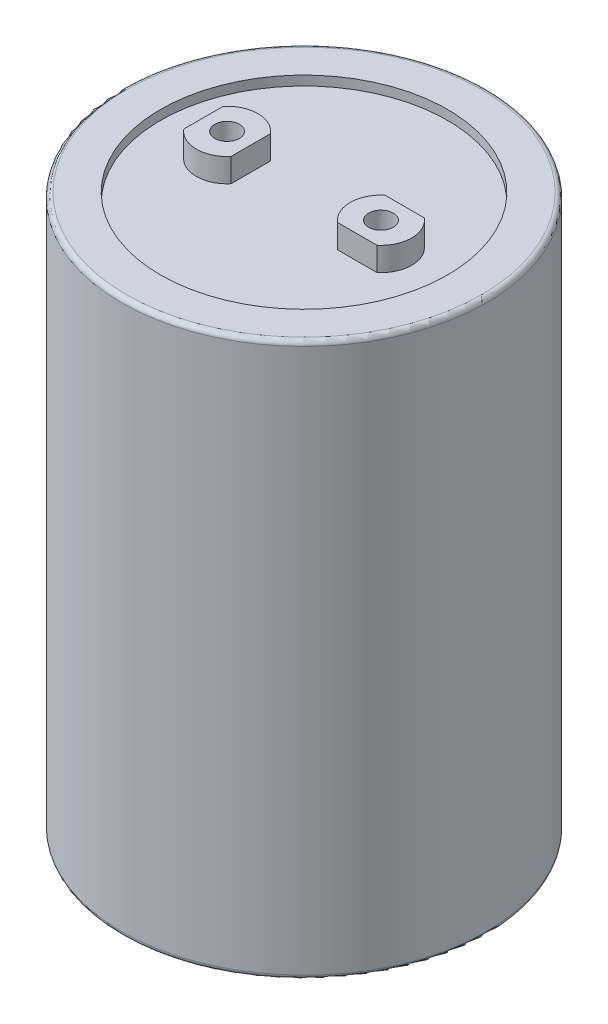
ISO-10303-21;
HEADER;
FILE_DESCRIPTION(('STEP AP214'),'2;1');
FILE_NAME('part.step','',(''),(''),'','','');
FILE_SCHEMA(('AUTOMOTIVE_DESIGN { 1 0 10303 214 1 1 1 1 }'));
ENDSEC;
DATA;
#1=APPLICATION_CONTEXT('core data for automotive mechanical design processes');
#2=APPLICATION_PROTOCOL_DEFINITION('international standard','automotive_design',2000,#1);
#3=PRODUCT_CONTEXT('',#1,'mechanical');
#4=PRODUCT('Part','Part','',(#3));
#5=PRODUCT_RELATED_PRODUCT_CATEGORY('part','',(#4));
#6=PRODUCT_DEFINITION_FORMATION('','',#4);
#7=PRODUCT_DEFINITION_CONTEXT('part definition',#1,'design');
#8=PRODUCT_DEFINITION('design','',#6,#7);
#9=PRODUCT_DEFINITION_SHAPE('','',#8);
#10=(LENGTH_UNIT() NAMED_UNIT(*) SI_UNIT(.MILLI.,.METRE.));
#11=(NAMED_UNIT(*) PLANE_ANGLE_UNIT() SI_UNIT($,.RADIAN.));
#12=(NAMED_UNIT(*) SI_UNIT($,.STERADIAN.) SOLID_ANGLE_UNIT());
#13=UNCERTAINTY_MEASURE_WITH_UNIT(LENGTH_MEASURE(1.E-05),#10,'distance_accuracy_value','');
#14=(GEOMETRIC_REPRESENTATION_CONTEXT(3) GLOBAL_UNCERTAINTY_ASSIGNED_CONTEXT((#13)) GLOBAL_UNIT_ASSIGNED_CONTEXT((#10,
#11,#12)) REPRESENTATION_CONTEXT('',''));
#15=CARTESIAN_POINT('',(0.,0.,0.));
#16=DIRECTION('',(0.,0.,1.));
#17=DIRECTION('',(1.,0.,0.));
#18=AXIS2_PLACEMENT_3D('',#15,#16,#17);
#19=CARTESIAN_POINT('',(0.,115.,0.));
#20=DIRECTION('',(0.,1.,0.));
#21=DIRECTION('',(0.,0.,1.));
#22=AXIS2_PLACEMENT_3D('',#19,#20,#21);
#23=PLANE('',#22);
#24=DIRECTION('',(0.,0.,1.));
#25=VECTOR('',#24,1.);
#26=CARTESIAN_POINT('',(-21.25,115.,-4.15331193145904));
#27=LINE('',#26,#25);
#28=CARTESIAN_POINT('',(-21.25,115.,-4.15331193145904));
#29=VERTEX_POINT('',#28);
#30=CARTESIAN_POINT('',(-21.25,115.,4.15331193145903));
#31=VERTEX_POINT('',#30);
#32=EDGE_CURVE('E148',#29,#31,#27,.T.);
#33=ORIENTED_EDGE('',*,*,#32,.F.);
#34=CARTESIAN_POINT('',(-16.25,115.,0.));
#35=DIRECTION('',(0.,1.,0.));
#36=DIRECTION('',(0.,0.,1.));
#37=AXIS2_PLACEMENT_3D('',#34,#35,#36);
#38=CIRCLE('',#37,6.5);
#39=CARTESIAN_POINT('',(-11.25,115.,-4.15331193145904));
#40=VERTEX_POINT('',#39);
#41=EDGE_CURVE('E130',#40,#29,#38,.T.);
#42=ORIENTED_EDGE('',*,*,#41,.F.);
#43=DIRECTION('',(0.,0.,-1.));
#44=VECTOR('',#43,1.);
#45=CARTESIAN_POINT('',(-11.25,115.,4.15331193145904));
#46=LINE('',#45,#44);
#47=CARTESIAN_POINT('',(-11.25,115.,4.15331193145904));
#48=VERTEX_POINT('',#47);
#49=EDGE_CURVE('E139',#48,#40,#46,.T.);
#50=ORIENTED_EDGE('',*,*,#49,.F.);
#51=CARTESIAN_POINT('',(-16.25,115.,0.));
#52=DIRECTION('',(0.,1.,0.));
#53=DIRECTION('',(0.,0.,-1.));
#54=AXIS2_PLACEMENT_3D('',#51,#52,#53);
#55=CIRCLE('',#54,6.5);
#56=EDGE_CURVE('E150',#31,#48,#55,.T.);
#57=ORIENTED_EDGE('',*,*,#56,.F.);
#58=EDGE_LOOP('',(#33,#42,#50,#57));
#59=FACE_BOUND('',#58,.T.);
#60=DIRECTION('',(-1.,0.,0.));
#61=VECTOR('',#60,1.);
#62=CARTESIAN_POINT('',(12.096688068541,115.,-5.));
#63=LINE('',#62,#61);
#64=CARTESIAN_POINT('',(20.403311931459,115.,-5.));
#65=VERTEX_POINT('',#64);
#66=CARTESIAN_POINT('',(12.096688068541,115.,-5.));
#67=VERTEX_POINT('',#66);
#68=EDGE_CURVE('E420',#65,#67,#63,.T.);
#69=ORIENTED_EDGE('',*,*,#68,.F.);
#70=CARTESIAN_POINT('',(16.25,115.,0.));
#71=DIRECTION('',(0.,1.,0.));
#72=DIRECTION('',(0.,0.,-1.));
#73=AXIS2_PLACEMENT_3D('',#70,#71,#72);
#74=CIRCLE('',#73,6.5);
#75=CARTESIAN_POINT('',(20.403311931459,115.,5.));
#76=VERTEX_POINT('',#75);
#77=EDGE_CURVE('E125',#76,#65,#74,.T.);
#78=ORIENTED_EDGE('',*,*,#77,.F.);
#79=DIRECTION('',(1.,0.,0.));
#80=VECTOR('',#79,1.);
#81=CARTESIAN_POINT('',(20.403311931459,115.,5.));
#82=LINE('',#81,#80);
#83=CARTESIAN_POINT('',(12.096688068541,115.,5.));
#84=VERTEX_POINT('',#83);
#85=EDGE_CURVE('E121',#84,#76,#82,.T.);
#86=ORIENTED_EDGE('',*,*,#85,.F.);
#87=CARTESIAN_POINT('',(16.25,115.,0.));
#88=DIRECTION('',(0.,1.,0.));
#89=DIRECTION('',(0.,0.,1.));
#90=AXIS2_PLACEMENT_3D('',#87,#88,#89);
#91=CIRCLE('',#90,6.50000000000001);
#92=EDGE_CURVE('E422',#67,#84,#91,.T.);
#93=ORIENTED_EDGE('',*,*,#92,.F.);
#94=EDGE_LOOP('',(#69,#78,#86,#93));
#95=FACE_BOUND('',#94,.T.);
#96=CARTESIAN_POINT('',(0.,115.,0.));
#97=DIRECTION('',(0.,1.,0.));
#98=DIRECTION('',(0.,0.,1.));
#99=AXIS2_PLACEMENT_3D('',#96,#97,#98);
#100=CIRCLE('',#99,30.3);
#101=CARTESIAN_POINT('',(0.,115.,30.3));
#102=VERTEX_POINT('',#101);
#103=EDGE_CURVE('E167',#102,#102,#100,.F.);
#104=ORIENTED_EDGE('',*,*,#103,.F.);
#105=EDGE_LOOP('',(#104));
#106=FACE_BOUND('',#105,.T.);
#107=ADVANCED_FACE('F35',(#59,#95,#106),#23,.T.);
#108=CARTESIAN_POINT('',(-16.25,120.,0.));
#109=DIRECTION('',(0.,1.,0.));
#110=DIRECTION('',(0.,0.,1.));
#111=AXIS2_PLACEMENT_3D('',#108,#109,#110);
#112=PLANE('',#111);
#113=CARTESIAN_POINT('',(-16.25,120.,0.));
#114=DIRECTION('',(0.,1.,0.));
#115=DIRECTION('',(0.,0.,1.));
#116=AXIS2_PLACEMENT_3D('',#113,#114,#115);
#117=CIRCLE('',#116,6.5);
#118=CARTESIAN_POINT('',(-11.25,120.,-4.15331193145904));
#119=VERTEX_POINT('',#118);
#120=CARTESIAN_POINT('',(-21.25,120.,-4.15331193145904));
#121=VERTEX_POINT('',#120);
#122=EDGE_CURVE('E135',#119,#121,#117,.T.);
#123=ORIENTED_EDGE('',*,*,#122,.T.);
#124=DIRECTION('',(0.,0.,1.));
#125=VECTOR('',#124,1.);
#126=CARTESIAN_POINT('',(-21.25,120.,-4.15331193145904));
#127=LINE('',#126,#125);
#128=CARTESIAN_POINT('',(-21.25,120.,4.15331193145903));
#129=VERTEX_POINT('',#128);
#130=EDGE_CURVE('E138',#121,#129,#127,.T.);
#131=ORIENTED_EDGE('',*,*,#130,.T.);
#132=CARTESIAN_POINT('',(-16.25,120.,0.));
#133=DIRECTION('',(0.,1.,0.));
#134=DIRECTION('',(0.,0.,-1.));
#135=AXIS2_PLACEMENT_3D('',#132,#133,#134);
#136=CIRCLE('',#135,6.5);
#137=CARTESIAN_POINT('',(-11.25,120.,4.15331193145904));
#138=VERTEX_POINT('',#137);
#139=EDGE_CURVE('E141',#129,#138,#136,.T.);
#140=ORIENTED_EDGE('',*,*,#139,.T.);
#141=DIRECTION('',(0.,0.,-1.));
#142=VECTOR('',#141,1.);
#143=CARTESIAN_POINT('',(-11.25,120.,4.15331193145904));
#144=LINE('',#143,#142);
#145=EDGE_CURVE('E143',#138,#119,#144,.T.);
#146=ORIENTED_EDGE('',*,*,#145,.T.);
#147=EDGE_LOOP('',(#123,#131,#140,#146));
#148=FACE_BOUND('',#147,.T.);
#149=CARTESIAN_POINT('',(-16.25,120.,0.));
#150=DIRECTION('',(0.,1.,0.));
#151=DIRECTION('',(0.,0.,1.));
#152=AXIS2_PLACEMENT_3D('',#149,#150,#151);
#153=CIRCLE('',#152,2.6);
#154=CARTESIAN_POINT('',(-16.25,120.,2.6));
#155=VERTEX_POINT('',#154);
#156=EDGE_CURVE('E127',#155,#155,#153,.T.);
#157=ORIENTED_EDGE('',*,*,#156,.F.);
#158=EDGE_LOOP('',(#157));
#159=FACE_BOUND('',#158,.T.);
#160=ADVANCED_FACE('F199',(#148,#159),#112,.T.);
#161=CARTESIAN_POINT('',(-16.25,120.,0.));
#162=DIRECTION('',(0.,-1.,0.));
#163=DIRECTION('',(0.,0.,-1.));
#164=AXIS2_PLACEMENT_3D('',#161,#162,#163);
#165=CYLINDRICAL_SURFACE('',#164,6.5);
#166=ORIENTED_EDGE('',*,*,#41,.T.);
#167=DIRECTION('',(0.,-1.,0.));
#168=VECTOR('',#167,1.);
#169=CARTESIAN_POINT('',(-21.25,120.,-4.15331193145904));
#170=LINE('',#169,#168);
#171=EDGE_CURVE('E159',#121,#29,#170,.T.);
#172=ORIENTED_EDGE('',*,*,#171,.F.);
#173=ORIENTED_EDGE('',*,*,#122,.F.);
#174=DIRECTION('',(0.,-1.,0.));
#175=VECTOR('',#174,1.);
#176=CARTESIAN_POINT('',(-11.25,120.,-4.15331193145904));
#177=LINE('',#176,#175);
#178=EDGE_CURVE('E145',#119,#40,#177,.T.);
#179=ORIENTED_EDGE('',*,*,#178,.T.);
#180=EDGE_LOOP('',(#166,#172,#173,#179));
#181=FACE_BOUND('',#180,.T.);
#182=ADVANCED_FACE('F207',(#181),#165,.T.);
#183=CARTESIAN_POINT('',(-21.25,120.,-4.15331193145904));
#184=DIRECTION('',(1.,0.,0.));
#185=DIRECTION('',(0.,0.,-1.));
#186=AXIS2_PLACEMENT_3D('',#183,#184,#185);
#187=PLANE('',#186);
#188=ORIENTED_EDGE('',*,*,#32,.T.);
#189=DIRECTION('',(0.,-1.,0.));
#190=VECTOR('',#189,1.);
#191=CARTESIAN_POINT('',(-21.25,120.,4.15331193145903));
#192=LINE('',#191,#190);
#193=EDGE_CURVE('E156',#129,#31,#192,.T.);
#194=ORIENTED_EDGE('',*,*,#193,.F.);
#195=ORIENTED_EDGE('',*,*,#130,.F.);
#196=ORIENTED_EDGE('',*,*,#171,.T.);
#197=EDGE_LOOP('',(#188,#194,#195,#196));
#198=FACE_BOUND('',#197,.T.);
#199=ADVANCED_FACE('F240',(#198),#187,.F.);
#200=CARTESIAN_POINT('',(-16.25,120.,0.));
#201=DIRECTION('',(0.,-1.,0.));
#202=DIRECTION('',(0.,0.,-1.));
#203=AXIS2_PLACEMENT_3D('',#200,#201,#202);
#204=CYLINDRICAL_SURFACE('',#203,6.5);
#205=ORIENTED_EDGE('',*,*,#56,.T.);
#206=DIRECTION('',(0.,-1.,0.));
#207=VECTOR('',#206,1.);
#208=CARTESIAN_POINT('',(-11.25,120.,4.15331193145904));
#209=LINE('',#208,#207);
#210=EDGE_CURVE('E58',#138,#48,#209,.T.);
#211=ORIENTED_EDGE('',*,*,#210,.F.);
#212=ORIENTED_EDGE('',*,*,#139,.F.);
#213=ORIENTED_EDGE('',*,*,#193,.T.);
#214=EDGE_LOOP('',(#205,#211,#212,#213));
#215=FACE_BOUND('',#214,.T.);
#216=ADVANCED_FACE('F233',(#215),#204,.T.);
#217=CARTESIAN_POINT('',(-11.25,120.,4.15331193145904));
#218=DIRECTION('',(-1.,0.,0.));
#219=DIRECTION('',(0.,0.,1.));
#220=AXIS2_PLACEMENT_3D('',#217,#218,#219);
#221=PLANE('',#220);
#222=ORIENTED_EDGE('',*,*,#49,.T.);
#223=ORIENTED_EDGE('',*,*,#178,.F.);
#224=ORIENTED_EDGE('',*,*,#145,.F.);
#225=ORIENTED_EDGE('',*,*,#210,.T.);
#226=EDGE_LOOP('',(#222,#223,#224,#225));
#227=FACE_BOUND('',#226,.T.);
#228=ADVANCED_FACE('F225',(#227),#221,.F.);
#229=CARTESIAN_POINT('',(-16.25,120.,0.));
#230=DIRECTION('',(0.,-1.,0.));
#231=DIRECTION('',(0.,0.,-1.));
#232=AXIS2_PLACEMENT_3D('',#229,#230,#231);
#233=CYLINDRICAL_SURFACE('',#232,2.6);
#234=ORIENTED_EDGE('',*,*,#156,.T.);
#235=EDGE_LOOP('',(#234));
#236=FACE_BOUND('',#235,.T.);
#237=CARTESIAN_POINT('',(-16.25,115.,0.));
#238=DIRECTION('',(0.,1.,0.));
#239=DIRECTION('',(0.,0.,1.));
#240=AXIS2_PLACEMENT_3D('',#237,#238,#239);
#241=CIRCLE('',#240,2.6);
#242=CARTESIAN_POINT('',(-16.25,115.,2.6));
#243=VERTEX_POINT('',#242);
#244=EDGE_CURVE('E161',#243,#243,#241,.F.);
#245=ORIENTED_EDGE('',*,*,#244,.T.);
#246=EDGE_LOOP('',(#245));
#247=FACE_BOUND('',#246,.T.);
#248=ADVANCED_FACE('F218',(#236,#247),#233,.F.);
#249=ORIENTED_EDGE('',*,*,#244,.F.);
#250=EDGE_LOOP('',(#249));
#251=FACE_BOUND('',#250,.T.);
#252=ADVANCED_FACE('F203',(#251),#23,.T.);
#253=CARTESIAN_POINT('',(16.25,120.,0.));
#254=DIRECTION('',(0.,-1.,0.));
#255=DIRECTION('',(0.,0.,-1.));
#256=AXIS2_PLACEMENT_3D('',#253,#254,#255);
#257=PLANE('',#256);
#258=CARTESIAN_POINT('',(16.25,120.,0.));
#259=DIRECTION('',(0.,1.,0.));
#260=DIRECTION('',(0.,0.,-1.));
#261=AXIS2_PLACEMENT_3D('',#258,#259,#260);
#262=CIRCLE('',#261,6.5);
#263=CARTESIAN_POINT('',(20.403311931459,120.,5.));
#264=VERTEX_POINT('',#263);
#265=CARTESIAN_POINT('',(20.403311931459,120.,-5.));
#266=VERTEX_POINT('',#265);
#267=EDGE_CURVE('E112',#264,#266,#262,.T.);
#268=ORIENTED_EDGE('',*,*,#267,.T.);
#269=DIRECTION('',(-1.,0.,0.));
#270=VECTOR('',#269,1.);
#271=CARTESIAN_POINT('',(12.096688068541,120.,-5.));
#272=LINE('',#271,#270);
#273=CARTESIAN_POINT('',(12.096688068541,120.,-5.));
#274=VERTEX_POINT('',#273);
#275=EDGE_CURVE('E101',#266,#274,#272,.T.);
#276=ORIENTED_EDGE('',*,*,#275,.T.);
#277=CARTESIAN_POINT('',(16.25,120.,0.));
#278=DIRECTION('',(0.,1.,0.));
#279=DIRECTION('',(0.,0.,1.));
#280=AXIS2_PLACEMENT_3D('',#277,#278,#279);
#281=CIRCLE('',#280,6.50000000000001);
#282=CARTESIAN_POINT('',(12.096688068541,120.,5.));
#283=VERTEX_POINT('',#282);
#284=EDGE_CURVE('E111',#274,#283,#281,.T.);
#285=ORIENTED_EDGE('',*,*,#284,.T.);
#286=DIRECTION('',(1.,0.,0.));
#287=VECTOR('',#286,1.);
#288=CARTESIAN_POINT('',(20.403311931459,120.,5.));
#289=LINE('',#288,#287);
#290=EDGE_CURVE('E117',#283,#264,#289,.T.);
#291=ORIENTED_EDGE('',*,*,#290,.T.);
#292=EDGE_LOOP('',(#268,#276,#285,#291));
#293=FACE_BOUND('',#292,.T.);
#294=CARTESIAN_POINT('',(16.25,120.,0.));
#295=DIRECTION('',(0.,1.,0.));
#296=DIRECTION('',(0.,0.,1.));
#297=AXIS2_PLACEMENT_3D('',#294,#295,#296);
#298=CIRCLE('',#297,2.6);
#299=CARTESIAN_POINT('',(16.25,120.,2.6));
#300=VERTEX_POINT('',#299);
#301=EDGE_CURVE('E411',#300,#300,#298,.T.);
#302=ORIENTED_EDGE('',*,*,#301,.F.);
#303=EDGE_LOOP('',(#302));
#304=FACE_BOUND('',#303,.T.);
#305=ADVANCED_FACE('F115',(#293,#304),#257,.F.);
#306=CARTESIAN_POINT('',(16.25,120.,0.));
#307=DIRECTION('',(0.,-1.,0.));
#308=DIRECTION('',(0.,0.,-1.));
#309=AXIS2_PLACEMENT_3D('',#306,#307,#308);
#310=CYLINDRICAL_SURFACE('',#309,6.5);
#311=ORIENTED_EDGE('',*,*,#77,.T.);
#312=DIRECTION('',(0.,-1.,0.));
#313=VECTOR('',#312,1.);
#314=CARTESIAN_POINT('',(20.403311931459,120.,-5.));
#315=LINE('',#314,#313);
#316=EDGE_CURVE('E105',#266,#65,#315,.T.);
#317=ORIENTED_EDGE('',*,*,#316,.F.);
#318=ORIENTED_EDGE('',*,*,#267,.F.);
#319=DIRECTION('',(0.,-1.,0.));
#320=VECTOR('',#319,1.);
#321=CARTESIAN_POINT('',(20.403311931459,120.,5.));
#322=LINE('',#321,#320);
#323=EDGE_CURVE('E418',#264,#76,#322,.T.);
#324=ORIENTED_EDGE('',*,*,#323,.T.);
#325=EDGE_LOOP('',(#311,#317,#318,#324));
#326=FACE_BOUND('',#325,.T.);
#327=ADVANCED_FACE('F123',(#326),#310,.T.);
#328=CARTESIAN_POINT('',(12.096688068541,120.,-5.));
#329=DIRECTION('',(0.,0.,1.));
#330=DIRECTION('',(1.,0.,0.));
#331=AXIS2_PLACEMENT_3D('',#328,#329,#330);
#332=PLANE('',#331);
#333=ORIENTED_EDGE('',*,*,#68,.T.);
#334=DIRECTION('',(0.,-1.,0.));
#335=VECTOR('',#334,1.);
#336=CARTESIAN_POINT('',(12.096688068541,120.,-5.));
#337=LINE('',#336,#335);
#338=EDGE_CURVE('E108',#274,#67,#337,.T.);
#339=ORIENTED_EDGE('',*,*,#338,.F.);
#340=ORIENTED_EDGE('',*,*,#275,.F.);
#341=ORIENTED_EDGE('',*,*,#316,.T.);
#342=EDGE_LOOP('',(#333,#339,#340,#341));
#343=FACE_BOUND('',#342,.T.);
#344=ADVANCED_FACE('F103',(#343),#332,.F.);
#345=CARTESIAN_POINT('',(16.25,120.,0.));
#346=DIRECTION('',(0.,-1.,0.));
#347=DIRECTION('',(0.,0.,-1.));
#348=AXIS2_PLACEMENT_3D('',#345,#346,#347);
#349=CYLINDRICAL_SURFACE('',#348,6.50000000000001);
#350=ORIENTED_EDGE('',*,*,#92,.T.);
#351=DIRECTION('',(0.,-1.,0.));
#352=VECTOR('',#351,1.);
#353=CARTESIAN_POINT('',(12.096688068541,120.,5.));
#354=LINE('',#353,#352);
#355=EDGE_CURVE('E50',#283,#84,#354,.T.);
#356=ORIENTED_EDGE('',*,*,#355,.F.);
#357=ORIENTED_EDGE('',*,*,#284,.F.);
#358=ORIENTED_EDGE('',*,*,#338,.T.);
#359=EDGE_LOOP('',(#350,#356,#357,#358));
#360=FACE_BOUND('',#359,.T.);
#361=ADVANCED_FACE('F304',(#360),#349,.T.);
#362=CARTESIAN_POINT('',(20.403311931459,120.,5.));
#363=DIRECTION('',(0.,0.,-1.));
#364=DIRECTION('',(-1.,0.,0.));
#365=AXIS2_PLACEMENT_3D('',#362,#363,#364);
#366=PLANE('',#365);
#367=ORIENTED_EDGE('',*,*,#85,.T.);
#368=ORIENTED_EDGE('',*,*,#323,.F.);
#369=ORIENTED_EDGE('',*,*,#290,.F.);
#370=ORIENTED_EDGE('',*,*,#355,.T.);
#371=EDGE_LOOP('',(#367,#368,#369,#370));
#372=FACE_BOUND('',#371,.T.);
#373=ADVANCED_FACE('F312',(#372),#366,.F.);
#374=CARTESIAN_POINT('',(16.25,120.,0.));
#375=DIRECTION('',(0.,-1.,0.));
#376=DIRECTION('',(0.,0.,-1.));
#377=AXIS2_PLACEMENT_3D('',#374,#375,#376);
#378=CYLINDRICAL_SURFACE('',#377,2.6);
#379=ORIENTED_EDGE('',*,*,#301,.T.);
#380=EDGE_LOOP('',(#379));
#381=FACE_BOUND('',#380,.T.);
#382=CARTESIAN_POINT('',(16.25,115.,0.));
#383=DIRECTION('',(0.,1.,0.));
#384=DIRECTION('',(0.,0.,1.));
#385=AXIS2_PLACEMENT_3D('',#382,#383,#384);
#386=CIRCLE('',#385,2.6);
#387=CARTESIAN_POINT('',(16.25,115.,2.6));
#388=VERTEX_POINT('',#387);
#389=EDGE_CURVE('E164',#388,#388,#386,.F.);
#390=ORIENTED_EDGE('',*,*,#389,.T.);
#391=EDGE_LOOP('',(#390));
#392=FACE_BOUND('',#391,.T.);
#393=ADVANCED_FACE('F215',(#381,#392),#378,.F.);
#394=ORIENTED_EDGE('',*,*,#389,.F.);
#395=EDGE_LOOP('',(#394));
#396=FACE_BOUND('',#395,.T.);
#397=ADVANCED_FACE('F202',(#396),#23,.T.);
#398=CARTESIAN_POINT('',(0.,117.,0.));
#399=DIRECTION('',(0.,1.,0.));
#400=DIRECTION('',(0.,0.,1.));
#401=AXIS2_PLACEMENT_3D('',#398,#399,#400);
#402=PLANE('',#401);
#403=CARTESIAN_POINT('',(0.,117.,0.));
#404=DIRECTION('',(0.,1.,0.));
#405=DIRECTION('',(0.,0.,1.));
#406=AXIS2_PLACEMENT_3D('',#403,#404,#405);
#407=CIRCLE('',#406,37.5);
#408=CARTESIAN_POINT('',(0.,117.,37.5));
#409=VERTEX_POINT('',#408);
#410=EDGE_CURVE('E43',#409,#409,#407,.T.);
#411=ORIENTED_EDGE('',*,*,#410,.T.);
#412=EDGE_LOOP('',(#411));
#413=FACE_BOUND('',#412,.T.);
#414=CARTESIAN_POINT('',(0.,117.,0.));
#415=DIRECTION('',(0.,1.,0.));
#416=DIRECTION('',(0.,0.,1.));
#417=AXIS2_PLACEMENT_3D('',#414,#415,#416);
#418=CIRCLE('',#417,30.3);
#419=CARTESIAN_POINT('',(0.,117.,30.3));
#420=VERTEX_POINT('',#419);
#421=EDGE_CURVE('E408',#420,#420,#418,.T.);
#422=ORIENTED_EDGE('',*,*,#421,.F.);
#423=EDGE_LOOP('',(#422));
#424=FACE_BOUND('',#423,.T.);
#425=ADVANCED_FACE('F181',(#413,#424),#402,.T.);
#426=CARTESIAN_POINT('',(0.,117.,0.));
#427=DIRECTION('',(0.,-1.,0.));
#428=DIRECTION('',(0.,0.,-1.));
#429=AXIS2_PLACEMENT_3D('',#426,#427,#428);
#430=CYLINDRICAL_SURFACE('',#429,30.3);
#431=ORIENTED_EDGE('',*,*,#421,.T.);
#432=EDGE_LOOP('',(#431));
#433=FACE_BOUND('',#432,.T.);
#434=ORIENTED_EDGE('',*,*,#103,.T.);
#435=EDGE_LOOP('',(#434));
#436=FACE_BOUND('',#435,.T.);
#437=ADVANCED_FACE('F347',(#433,#436),#430,.F.);
#438=CARTESIAN_POINT('',(0.,0.,0.));
#439=DIRECTION('',(0.,1.,0.));
#440=DIRECTION('',(0.,0.,1.));
#441=AXIS2_PLACEMENT_3D('',#438,#439,#440);
#442=PLANE('',#441);
#443=CARTESIAN_POINT('',(0.,0.,0.));
#444=DIRECTION('',(0.,1.,0.));
#445=DIRECTION('',(0.,0.,1.));
#446=AXIS2_PLACEMENT_3D('',#443,#444,#445);
#447=CIRCLE('',#446,6.);
#448=CARTESIAN_POINT('',(0.,0.,6.));
#449=VERTEX_POINT('',#448);
#450=EDGE_CURVE('E11',#449,#449,#447,.F.);
#451=ORIENTED_EDGE('',*,*,#450,.F.);
#452=EDGE_LOOP('',(#451));
#453=FACE_BOUND('',#452,.T.);
#454=CARTESIAN_POINT('',(0.,0.,0.));
#455=DIRECTION('',(0.,1.,0.));
#456=DIRECTION('',(0.,0.,1.));
#457=AXIS2_PLACEMENT_3D('',#454,#455,#456);
#458=CIRCLE('',#457,37.5);
#459=CARTESIAN_POINT('',(0.,0.,37.5));
#460=VERTEX_POINT('',#459);
#461=EDGE_CURVE('E176',#460,#460,#458,.F.);
#462=ORIENTED_EDGE('',*,*,#461,.T.);
#463=EDGE_LOOP('',(#462));
#464=FACE_BOUND('',#463,.T.);
#465=ADVANCED_FACE('F352',(#453,#464),#442,.F.);
#466=CARTESIAN_POINT('',(0.,115.,0.));
#467=DIRECTION('',(0.,-1.,0.));
#468=DIRECTION('',(0.,0.,-1.));
#469=AXIS2_PLACEMENT_3D('',#466,#467,#468);
#470=CYLINDRICAL_SURFACE('',#469,38.5);
#471=CARTESIAN_POINT('',(0.,1.,0.));
#472=DIRECTION('',(0.,1.,0.));
#473=DIRECTION('',(0.,0.,1.));
#474=AXIS2_PLACEMENT_3D('',#471,#472,#473);
#475=CIRCLE('',#474,38.5);
#476=CARTESIAN_POINT('',(0.,1.,38.5));
#477=VERTEX_POINT('',#476);
#478=EDGE_CURVE('E173',#477,#477,#475,.T.);
#479=ORIENTED_EDGE('',*,*,#478,.T.);
#480=EDGE_LOOP('',(#479));
#481=FACE_BOUND('',#480,.T.);
#482=CARTESIAN_POINT('',(0.,116.,0.));
#483=DIRECTION('',(0.,1.,0.));
#484=DIRECTION('',(0.,0.,1.));
#485=AXIS2_PLACEMENT_3D('',#482,#483,#484);
#486=CIRCLE('',#485,38.5);
#487=CARTESIAN_POINT('',(0.,116.,38.5));
#488=VERTEX_POINT('',#487);
#489=EDGE_CURVE('E170',#488,#488,#486,.F.);
#490=ORIENTED_EDGE('',*,*,#489,.T.);
#491=EDGE_LOOP('',(#490));
#492=FACE_BOUND('',#491,.T.);
#493=ADVANCED_FACE('F195',(#481,#492),#470,.T.);
#494=CARTESIAN_POINT('',(0.,1.,0.));
#495=DIRECTION('',(0.,1.,0.));
#496=DIRECTION('',(0.,0.,1.));
#497=AXIS2_PLACEMENT_3D('',#494,#495,#496);
#498=TOROIDAL_SURFACE('',#497,37.5,1.);
#499=ORIENTED_EDGE('',*,*,#461,.F.);
#500=EDGE_LOOP('',(#499));
#501=FACE_BOUND('',#500,.T.);
#502=ORIENTED_EDGE('',*,*,#478,.F.);
#503=EDGE_LOOP('',(#502));
#504=FACE_BOUND('',#503,.T.);
#505=ADVANCED_FACE('F186',(#501,#504),#498,.T.);
#506=CARTESIAN_POINT('',(0.,116.,0.));
#507=DIRECTION('',(0.,1.,0.));
#508=DIRECTION('',(0.,0.,1.));
#509=AXIS2_PLACEMENT_3D('',#506,#507,#508);
#510=TOROIDAL_SURFACE('',#509,37.5,1.);
#511=ORIENTED_EDGE('',*,*,#489,.F.);
#512=EDGE_LOOP('',(#511));
#513=FACE_BOUND('',#512,.T.);
#514=ORIENTED_EDGE('',*,*,#410,.F.);
#515=EDGE_LOOP('',(#514));
#516=FACE_BOUND('',#515,.T.);
#517=ADVANCED_FACE('F37',(#513,#516),#510,.T.);
#518=CARTESIAN_POINT('',(0.,-16.,0.));
#519=DIRECTION('',(0.,1.,0.));
#520=DIRECTION('',(0.,0.,1.));
#521=AXIS2_PLACEMENT_3D('',#518,#519,#520);
#522=CYLINDRICAL_SURFACE('',#521,6.);
#523=CARTESIAN_POINT('',(0.,-16.,0.));
#524=DIRECTION('',(0.,-1.,0.));
#525=DIRECTION('',(0.,0.,-1.));
#526=AXIS2_PLACEMENT_3D('',#523,#524,#525);
#527=CIRCLE('',#526,6.);
#528=CARTESIAN_POINT('',(0.,-16.,-6.));
#529=VERTEX_POINT('',#528);
#530=EDGE_CURVE('E407',#529,#529,#527,.T.);
#531=ORIENTED_EDGE('',*,*,#530,.F.);
#532=EDGE_LOOP('',(#531));
#533=FACE_BOUND('',#532,.T.);
#534=ORIENTED_EDGE('',*,*,#450,.T.);
#535=EDGE_LOOP('',(#534));
#536=FACE_BOUND('',#535,.T.);
#537=ADVANCED_FACE('F185',(#533,#536),#522,.T.);
#538=CARTESIAN_POINT('',(0.,-16.,0.));
#539=DIRECTION('',(0.,-1.,0.));
#540=DIRECTION('',(0.,0.,-1.));
#541=AXIS2_PLACEMENT_3D('',#538,#539,#540);
#542=PLANE('',#541);
#543=ORIENTED_EDGE('',*,*,#530,.T.);
#544=EDGE_LOOP('',(#543));
#545=FACE_BOUND('',#544,.T.);
#546=ADVANCED_FACE('F192',(#545),#542,.T.);
#547=CLOSED_SHELL('',(#107,#160,#182,#199,#216,#228,#248,#252,#305,#327,#344,#361,#373,#393,
#397,#425,#437,#465,#493,#505,#517,#537,#546));
#548=MANIFOLD_SOLID_BREP('B2',#547);
#549=ADVANCED_BREP_SHAPE_REPRESENTATION('',(#18,#548),#14);
#550=SHAPE_DEFINITION_REPRESENTATION(#9,#549);
ENDSEC;
END-ISO-10303-21;
